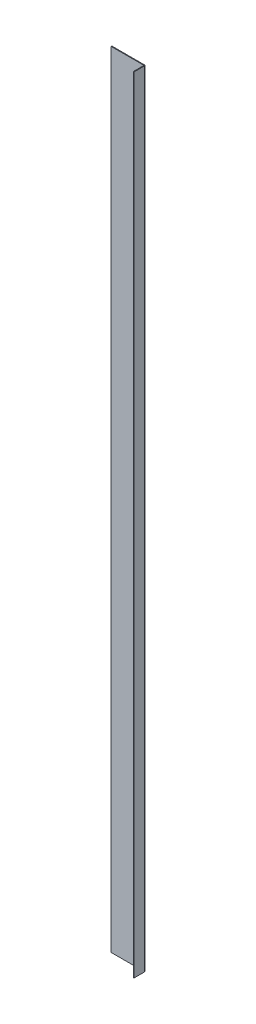
ISO-10303-21;
HEADER;
FILE_DESCRIPTION(('STEP AP214'),'2;1');
FILE_NAME('part.step','',(''),(''),'','','');
FILE_SCHEMA(('AUTOMOTIVE_DESIGN { 1 0 10303 214 1 1 1 1 }'));
ENDSEC;
DATA;
#1=APPLICATION_CONTEXT('core data for automotive mechanical design processes');
#2=APPLICATION_PROTOCOL_DEFINITION('international standard','automotive_design',2000,#1);
#3=PRODUCT_CONTEXT('',#1,'mechanical');
#4=PRODUCT('Part','Part','',(#3));
#5=PRODUCT_RELATED_PRODUCT_CATEGORY('part','',(#4));
#6=PRODUCT_DEFINITION_FORMATION('','',#4);
#7=PRODUCT_DEFINITION_CONTEXT('part definition',#1,'design');
#8=PRODUCT_DEFINITION('design','',#6,#7);
#9=PRODUCT_DEFINITION_SHAPE('','',#8);
#10=(LENGTH_UNIT() NAMED_UNIT(*) SI_UNIT(.MILLI.,.METRE.));
#11=(NAMED_UNIT(*) PLANE_ANGLE_UNIT() SI_UNIT($,.RADIAN.));
#12=(NAMED_UNIT(*) SI_UNIT($,.STERADIAN.) SOLID_ANGLE_UNIT());
#13=UNCERTAINTY_MEASURE_WITH_UNIT(LENGTH_MEASURE(1.E-05),#10,'distance_accuracy_value','');
#14=(GEOMETRIC_REPRESENTATION_CONTEXT(3) GLOBAL_UNCERTAINTY_ASSIGNED_CONTEXT((#13)) GLOBAL_UNIT_ASSIGNED_CONTEXT((#10,
#11,#12)) REPRESENTATION_CONTEXT('',''));
#15=CARTESIAN_POINT('',(0.,0.,0.));
#16=DIRECTION('',(0.,0.,1.));
#17=DIRECTION('',(1.,0.,0.));
#18=AXIS2_PLACEMENT_3D('',#15,#16,#17);
#19=CARTESIAN_POINT('',(0.,2270.,-2.));
#20=DIRECTION('',(0.,1.,0.));
#21=DIRECTION('',(0.,0.,1.));
#22=AXIS2_PLACEMENT_3D('',#19,#20,#21);
#23=PLANE('',#22);
#24=DIRECTION('',(-1.,0.,0.));
#25=VECTOR('',#24,1.);
#26=CARTESIAN_POINT('',(0.,2270.,0.));
#27=LINE('',#26,#25);
#28=CARTESIAN_POINT('',(94.2634,2270.,0.));
#29=VERTEX_POINT('',#28);
#30=CARTESIAN_POINT('',(0.,2270.,0.));
#31=VERTEX_POINT('',#30);
#32=EDGE_CURVE('E91',#29,#31,#27,.T.);
#33=ORIENTED_EDGE('',*,*,#32,.F.);
#34=DIRECTION('',(0.,0.,-1.));
#35=VECTOR('',#34,1.);
#36=CARTESIAN_POINT('',(94.2634,2270.,0.));
#37=LINE('',#36,#35);
#38=CARTESIAN_POINT('',(94.2634,2270.,-1.99999999999998));
#39=VERTEX_POINT('',#38);
#40=EDGE_CURVE('E104',#29,#39,#37,.T.);
#41=ORIENTED_EDGE('',*,*,#40,.T.);
#42=DIRECTION('',(-1.,0.,0.));
#43=VECTOR('',#42,1.);
#44=CARTESIAN_POINT('',(0.,2270.,-2.));
#45=LINE('',#44,#43);
#46=CARTESIAN_POINT('',(0.,2270.,-2.));
#47=VERTEX_POINT('',#46);
#48=EDGE_CURVE('E98',#39,#47,#45,.T.);
#49=ORIENTED_EDGE('',*,*,#48,.T.);
#50=DIRECTION('',(0.,0.,1.));
#51=VECTOR('',#50,1.);
#52=CARTESIAN_POINT('',(0.,2270.,-2.));
#53=LINE('',#52,#51);
#54=EDGE_CURVE('E47',#47,#31,#53,.T.);
#55=ORIENTED_EDGE('',*,*,#54,.T.);
#56=EDGE_LOOP('',(#33,#41,#49,#55));
#57=FACE_BOUND('',#56,.T.);
#58=ADVANCED_FACE('F43',(#57),#23,.T.);
#59=CARTESIAN_POINT('',(0.,0.,-2.));
#60=DIRECTION('',(0.,0.,-1.));
#61=DIRECTION('',(-1.,0.,0.));
#62=AXIS2_PLACEMENT_3D('',#59,#60,#61);
#63=PLANE('',#62);
#64=ORIENTED_EDGE('',*,*,#48,.F.);
#65=DIRECTION('',(0.,1.,0.));
#66=VECTOR('',#65,1.);
#67=CARTESIAN_POINT('',(94.2634,2270.,-1.99999999999998));
#68=LINE('',#67,#66);
#69=CARTESIAN_POINT('',(94.2634,0.,-2.));
#70=VERTEX_POINT('',#69);
#71=EDGE_CURVE('E121',#39,#70,#68,.F.);
#72=ORIENTED_EDGE('',*,*,#71,.T.);
#73=DIRECTION('',(1.,0.,0.));
#74=VECTOR('',#73,1.);
#75=CARTESIAN_POINT('',(95.,0.,-2.));
#76=LINE('',#75,#74);
#77=CARTESIAN_POINT('',(0.,0.,-2.));
#78=VERTEX_POINT('',#77);
#79=EDGE_CURVE('E96',#78,#70,#76,.T.);
#80=ORIENTED_EDGE('',*,*,#79,.F.);
#81=DIRECTION('',(0.,-1.,0.));
#82=VECTOR('',#81,1.);
#83=CARTESIAN_POINT('',(0.,0.,-2.));
#84=LINE('',#83,#82);
#85=EDGE_CURVE('E83',#47,#78,#84,.T.);
#86=ORIENTED_EDGE('',*,*,#85,.F.);
#87=EDGE_LOOP('',(#64,#72,#80,#86));
#88=FACE_BOUND('',#87,.T.);
#89=ADVANCED_FACE('F209',(#88),#63,.T.);
#90=CARTESIAN_POINT('',(0.,0.,0.));
#91=DIRECTION('',(0.,0.,-1.));
#92=DIRECTION('',(-1.,0.,0.));
#93=AXIS2_PLACEMENT_3D('',#90,#91,#92);
#94=PLANE('',#93);
#95=DIRECTION('',(0.,1.,0.));
#96=VECTOR('',#95,1.);
#97=CARTESIAN_POINT('',(94.2634,2270.,0.));
#98=LINE('',#97,#96);
#99=CARTESIAN_POINT('',(94.2634,0.,0.));
#100=VERTEX_POINT('',#99);
#101=EDGE_CURVE('E111',#29,#100,#98,.F.);
#102=ORIENTED_EDGE('',*,*,#101,.F.);
#103=ORIENTED_EDGE('',*,*,#32,.T.);
#104=DIRECTION('',(0.,-1.,0.));
#105=VECTOR('',#104,1.);
#106=CARTESIAN_POINT('',(0.,0.,0.));
#107=LINE('',#106,#105);
#108=CARTESIAN_POINT('',(0.,0.,0.));
#109=VERTEX_POINT('',#108);
#110=EDGE_CURVE('E81',#31,#109,#107,.T.);
#111=ORIENTED_EDGE('',*,*,#110,.T.);
#112=DIRECTION('',(1.,0.,0.));
#113=VECTOR('',#112,1.);
#114=CARTESIAN_POINT('',(95.,0.,0.));
#115=LINE('',#114,#113);
#116=EDGE_CURVE('E86',#109,#100,#115,.T.);
#117=ORIENTED_EDGE('',*,*,#116,.T.);
#118=EDGE_LOOP('',(#102,#103,#111,#117));
#119=FACE_BOUND('',#118,.T.);
#120=ADVANCED_FACE('F93',(#119),#94,.F.);
#121=CARTESIAN_POINT('',(95.,0.,-2.));
#122=DIRECTION('',(0.,-1.,0.));
#123=DIRECTION('',(1.,0.,0.));
#124=AXIS2_PLACEMENT_3D('',#121,#122,#123);
#125=PLANE('',#124);
#126=DIRECTION('',(0.,0.,-1.));
#127=VECTOR('',#126,1.);
#128=CARTESIAN_POINT('',(94.2634,0.,0.));
#129=LINE('',#128,#127);
#130=EDGE_CURVE('E88',#100,#70,#129,.T.);
#131=ORIENTED_EDGE('',*,*,#130,.F.);
#132=ORIENTED_EDGE('',*,*,#116,.F.);
#133=DIRECTION('',(0.,0.,1.));
#134=VECTOR('',#133,1.);
#135=CARTESIAN_POINT('',(0.,0.,-2.));
#136=LINE('',#135,#134);
#137=EDGE_CURVE('E11',#78,#109,#136,.T.);
#138=ORIENTED_EDGE('',*,*,#137,.F.);
#139=ORIENTED_EDGE('',*,*,#79,.T.);
#140=EDGE_LOOP('',(#131,#132,#138,#139));
#141=FACE_BOUND('',#140,.T.);
#142=ADVANCED_FACE('F45',(#141),#125,.T.);
#143=CARTESIAN_POINT('',(0.,0.,-2.));
#144=DIRECTION('',(-1.,0.,0.));
#145=DIRECTION('',(0.,0.,1.));
#146=AXIS2_PLACEMENT_3D('',#143,#144,#145);
#147=PLANE('',#146);
#148=ORIENTED_EDGE('',*,*,#110,.F.);
#149=ORIENTED_EDGE('',*,*,#54,.F.);
#150=ORIENTED_EDGE('',*,*,#85,.T.);
#151=ORIENTED_EDGE('',*,*,#137,.T.);
#152=EDGE_LOOP('',(#148,#149,#150,#151));
#153=FACE_BOUND('',#152,.T.);
#154=ADVANCED_FACE('F78',(#153),#147,.T.);
#155=CARTESIAN_POINT('',(94.2634,0.,0.736600000000027));
#156=DIRECTION('',(0.,-1.,0.));
#157=DIRECTION('',(0.,0.,-1.));
#158=AXIS2_PLACEMENT_3D('',#155,#156,#157);
#159=PLANE('',#158);
#160=DIRECTION('',(1.,0.,0.));
#161=VECTOR('',#160,1.);
#162=CARTESIAN_POINT('',(95.,0.,0.736600000000004));
#163=LINE('',#162,#161);
#164=CARTESIAN_POINT('',(95.,0.,0.736600000000025));
#165=VERTEX_POINT('',#164);
#166=CARTESIAN_POINT('',(97.,0.,0.736600000000017));
#167=VERTEX_POINT('',#166);
#168=EDGE_CURVE('E151',#165,#167,#163,.T.);
#169=ORIENTED_EDGE('',*,*,#168,.F.);
#170=CARTESIAN_POINT('',(94.2634,0.,0.736600000000027));
#171=DIRECTION('',(0.,1.,0.));
#172=DIRECTION('',(0.,0.,1.));
#173=AXIS2_PLACEMENT_3D('',#170,#171,#172);
#174=CIRCLE('',#173,0.736600000000004);
#175=EDGE_CURVE('E115',#100,#165,#174,.F.);
#176=ORIENTED_EDGE('',*,*,#175,.F.);
#177=ORIENTED_EDGE('',*,*,#130,.T.);
#178=CARTESIAN_POINT('',(94.2634,0.,0.736600000000027));
#179=DIRECTION('',(0.,1.,0.));
#180=DIRECTION('',(0.,0.,1.));
#181=AXIS2_PLACEMENT_3D('',#178,#179,#180);
#182=CIRCLE('',#181,2.7366);
#183=EDGE_CURVE('E58',#70,#167,#182,.F.);
#184=ORIENTED_EDGE('',*,*,#183,.T.);
#185=EDGE_LOOP('',(#169,#176,#177,#184));
#186=FACE_BOUND('',#185,.T.);
#187=ADVANCED_FACE('F206',(#186),#159,.T.);
#188=CARTESIAN_POINT('',(94.2634,2270.,0.736600000000027));
#189=DIRECTION('',(0.,-1.,0.));
#190=DIRECTION('',(0.,0.,-1.));
#191=AXIS2_PLACEMENT_3D('',#188,#189,#190);
#192=PLANE('',#191);
#193=CARTESIAN_POINT('',(94.2634,2270.,0.736600000000027));
#194=DIRECTION('',(0.,1.,0.));
#195=DIRECTION('',(0.,0.,1.));
#196=AXIS2_PLACEMENT_3D('',#193,#194,#195);
#197=CIRCLE('',#196,0.736600000000004);
#198=CARTESIAN_POINT('',(95.,2270.,0.736600000000025));
#199=VERTEX_POINT('',#198);
#200=EDGE_CURVE('E108',#199,#29,#197,.T.);
#201=ORIENTED_EDGE('',*,*,#200,.F.);
#202=DIRECTION('',(1.,0.,0.));
#203=VECTOR('',#202,1.);
#204=CARTESIAN_POINT('',(95.,2270.,0.736600000000046));
#205=LINE('',#204,#203);
#206=CARTESIAN_POINT('',(97.,2270.,0.736600000000038));
#207=VERTEX_POINT('',#206);
#208=EDGE_CURVE('E150',#199,#207,#205,.T.);
#209=ORIENTED_EDGE('',*,*,#208,.T.);
#210=CARTESIAN_POINT('',(94.2634,2270.,0.736600000000027));
#211=DIRECTION('',(0.,1.,0.));
#212=DIRECTION('',(0.,0.,1.));
#213=AXIS2_PLACEMENT_3D('',#210,#211,#212);
#214=CIRCLE('',#213,2.7366);
#215=EDGE_CURVE('E118',#207,#39,#214,.T.);
#216=ORIENTED_EDGE('',*,*,#215,.T.);
#217=ORIENTED_EDGE('',*,*,#40,.F.);
#218=EDGE_LOOP('',(#201,#209,#216,#217));
#219=FACE_BOUND('',#218,.T.);
#220=ADVANCED_FACE('F172',(#219),#192,.F.);
#221=CARTESIAN_POINT('',(94.2634,2270.,0.736600000000027));
#222=DIRECTION('',(0.,1.,0.));
#223=DIRECTION('',(1.,0.,0.));
#224=AXIS2_PLACEMENT_3D('',#221,#222,#223);
#225=CYLINDRICAL_SURFACE('',#224,2.7366);
#226=ORIENTED_EDGE('',*,*,#71,.F.);
#227=ORIENTED_EDGE('',*,*,#215,.F.);
#228=DIRECTION('',(0.,-1.,0.));
#229=VECTOR('',#228,1.);
#230=CARTESIAN_POINT('',(97.,0.,0.736599999999996));
#231=LINE('',#230,#229);
#232=EDGE_CURVE('E141',#207,#167,#231,.T.);
#233=ORIENTED_EDGE('',*,*,#232,.T.);
#234=ORIENTED_EDGE('',*,*,#183,.F.);
#235=EDGE_LOOP('',(#226,#227,#233,#234));
#236=FACE_BOUND('',#235,.T.);
#237=ADVANCED_FACE('F210',(#236),#225,.T.);
#238=CARTESIAN_POINT('',(94.2634,2270.,0.736600000000027));
#239=DIRECTION('',(0.,1.,0.));
#240=DIRECTION('',(1.,0.,0.));
#241=AXIS2_PLACEMENT_3D('',#238,#239,#240);
#242=CYLINDRICAL_SURFACE('',#241,0.736600000000004);
#243=ORIENTED_EDGE('',*,*,#101,.T.);
#244=ORIENTED_EDGE('',*,*,#175,.T.);
#245=DIRECTION('',(0.,1.,0.));
#246=VECTOR('',#245,1.);
#247=CARTESIAN_POINT('',(95.,0.,0.736600000000004));
#248=LINE('',#247,#246);
#249=EDGE_CURVE('E154',#165,#199,#248,.T.);
#250=ORIENTED_EDGE('',*,*,#249,.T.);
#251=ORIENTED_EDGE('',*,*,#200,.T.);
#252=EDGE_LOOP('',(#243,#244,#250,#251));
#253=FACE_BOUND('',#252,.T.);
#254=ADVANCED_FACE('F162',(#253),#242,.F.);
#255=CARTESIAN_POINT('',(97.,0.,0.));
#256=DIRECTION('',(0.,1.,0.));
#257=DIRECTION('',(0.,0.,1.));
#258=AXIS2_PLACEMENT_3D('',#255,#256,#257);
#259=PLANE('',#258);
#260=ORIENTED_EDGE('',*,*,#168,.T.);
#261=DIRECTION('',(0.,0.,-1.));
#262=VECTOR('',#261,1.);
#263=CARTESIAN_POINT('',(97.,0.,0.));
#264=LINE('',#263,#262);
#265=CARTESIAN_POINT('',(97.0000000000001,-1.76534454085198E-13,30.74));
#266=VERTEX_POINT('',#265);
#267=EDGE_CURVE('E134',#266,#167,#264,.T.);
#268=ORIENTED_EDGE('',*,*,#267,.F.);
#269=DIRECTION('',(-1.,0.,0.));
#270=VECTOR('',#269,1.);
#271=CARTESIAN_POINT('',(97.0000000000001,-1.76534454085198E-13,30.74));
#272=LINE('',#271,#270);
#273=CARTESIAN_POINT('',(95.0000000000001,-1.76534454085198E-13,30.74));
#274=VERTEX_POINT('',#273);
#275=EDGE_CURVE('E127',#266,#274,#272,.T.);
#276=ORIENTED_EDGE('',*,*,#275,.T.);
#277=DIRECTION('',(0.,0.,-1.));
#278=VECTOR('',#277,1.);
#279=CARTESIAN_POINT('',(95.,0.,0.));
#280=LINE('',#279,#278);
#281=EDGE_CURVE('E138',#274,#165,#280,.T.);
#282=ORIENTED_EDGE('',*,*,#281,.T.);
#283=EDGE_LOOP('',(#260,#268,#276,#282));
#284=FACE_BOUND('',#283,.T.);
#285=ADVANCED_FACE('F193',(#284),#259,.F.);
#286=CARTESIAN_POINT('',(97.0000000000001,2270.,30.74));
#287=DIRECTION('',(0.,-1.,0.));
#288=DIRECTION('',(0.,0.,-1.));
#289=AXIS2_PLACEMENT_3D('',#286,#287,#288);
#290=PLANE('',#289);
#291=ORIENTED_EDGE('',*,*,#208,.F.);
#292=DIRECTION('',(0.,0.,1.));
#293=VECTOR('',#292,1.);
#294=CARTESIAN_POINT('',(95.0000000000001,2270.,30.74));
#295=LINE('',#294,#293);
#296=CARTESIAN_POINT('',(95.0000000000001,2270.,30.74));
#297=VERTEX_POINT('',#296);
#298=EDGE_CURVE('E135',#199,#297,#295,.T.);
#299=ORIENTED_EDGE('',*,*,#298,.T.);
#300=DIRECTION('',(-1.,0.,0.));
#301=VECTOR('',#300,1.);
#302=CARTESIAN_POINT('',(97.0000000000001,2270.,30.74));
#303=LINE('',#302,#301);
#304=CARTESIAN_POINT('',(97.0000000000001,2270.,30.74));
#305=VERTEX_POINT('',#304);
#306=EDGE_CURVE('E112',#305,#297,#303,.T.);
#307=ORIENTED_EDGE('',*,*,#306,.F.);
#308=DIRECTION('',(0.,0.,1.));
#309=VECTOR('',#308,1.);
#310=CARTESIAN_POINT('',(97.0000000000001,2270.,30.74));
#311=LINE('',#310,#309);
#312=EDGE_CURVE('E144',#207,#305,#311,.T.);
#313=ORIENTED_EDGE('',*,*,#312,.F.);
#314=EDGE_LOOP('',(#291,#299,#307,#313));
#315=FACE_BOUND('',#314,.T.);
#316=ADVANCED_FACE('F177',(#315),#290,.F.);
#317=CARTESIAN_POINT('',(97.,0.,-3.50090273475962E-13));
#318=DIRECTION('',(-1.,0.,0.));
#319=DIRECTION('',(0.,0.,1.));
#320=AXIS2_PLACEMENT_3D('',#317,#318,#319);
#321=PLANE('',#320);
#322=ORIENTED_EDGE('',*,*,#232,.F.);
#323=ORIENTED_EDGE('',*,*,#312,.T.);
#324=DIRECTION('',(0.,-1.,0.));
#325=VECTOR('',#324,1.);
#326=CARTESIAN_POINT('',(97.0000000000001,-1.76534454085198E-13,30.74));
#327=LINE('',#326,#325);
#328=EDGE_CURVE('E130',#305,#266,#327,.T.);
#329=ORIENTED_EDGE('',*,*,#328,.T.);
#330=ORIENTED_EDGE('',*,*,#267,.T.);
#331=EDGE_LOOP('',(#322,#323,#329,#330));
#332=FACE_BOUND('',#331,.T.);
#333=ADVANCED_FACE('F198',(#332),#321,.F.);
#334=CARTESIAN_POINT('',(95.,0.,-3.43107310798275E-13));
#335=DIRECTION('',(-1.,0.,0.));
#336=DIRECTION('',(0.,0.,1.));
#337=AXIS2_PLACEMENT_3D('',#334,#335,#336);
#338=PLANE('',#337);
#339=ORIENTED_EDGE('',*,*,#298,.F.);
#340=ORIENTED_EDGE('',*,*,#249,.F.);
#341=ORIENTED_EDGE('',*,*,#281,.F.);
#342=DIRECTION('',(0.,-1.,0.));
#343=VECTOR('',#342,1.);
#344=CARTESIAN_POINT('',(95.0000000000001,-1.76534454085198E-13,30.74));
#345=LINE('',#344,#343);
#346=EDGE_CURVE('E131',#297,#274,#345,.T.);
#347=ORIENTED_EDGE('',*,*,#346,.F.);
#348=EDGE_LOOP('',(#339,#340,#341,#347));
#349=FACE_BOUND('',#348,.T.);
#350=ADVANCED_FACE('F181',(#349),#338,.T.);
#351=CARTESIAN_POINT('',(97.0000000000001,-1.76534454085198E-13,30.74));
#352=DIRECTION('',(0.,0.,-1.));
#353=DIRECTION('',(-1.,0.,0.));
#354=AXIS2_PLACEMENT_3D('',#351,#352,#353);
#355=PLANE('',#354);
#356=ORIENTED_EDGE('',*,*,#346,.T.);
#357=ORIENTED_EDGE('',*,*,#275,.F.);
#358=ORIENTED_EDGE('',*,*,#328,.F.);
#359=ORIENTED_EDGE('',*,*,#306,.T.);
#360=EDGE_LOOP('',(#356,#357,#358,#359));
#361=FACE_BOUND('',#360,.T.);
#362=ADVANCED_FACE('F186',(#361),#355,.F.);
#363=CLOSED_SHELL('',(#58,#89,#120,#142,#154,#187,#220,#237,#254,#285,#316,#333,#350,#362));
#364=MANIFOLD_SOLID_BREP('B2',#363);
#365=ADVANCED_BREP_SHAPE_REPRESENTATION('',(#18,#364),#14);
#366=SHAPE_DEFINITION_REPRESENTATION(#9,#365);
ENDSEC;
END-ISO-10303-21;
